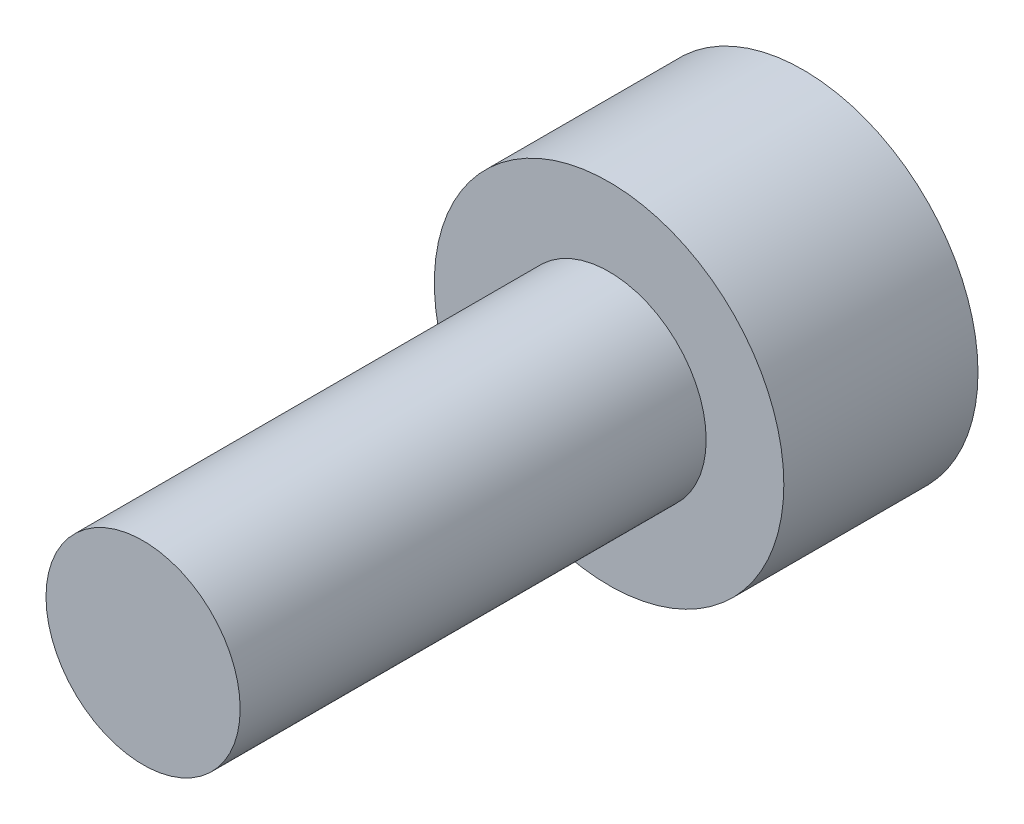
ISO-10303-21;
HEADER;
FILE_DESCRIPTION(('STEP AP214'),'2;1');
FILE_NAME('part.step','',(''),(''),'','','');
FILE_SCHEMA(('AUTOMOTIVE_DESIGN { 1 0 10303 214 1 1 1 1 }'));
ENDSEC;
DATA;
#1=APPLICATION_CONTEXT('core data for automotive mechanical design processes');
#2=APPLICATION_PROTOCOL_DEFINITION('international standard','automotive_design',2000,#1);
#3=PRODUCT_CONTEXT('',#1,'mechanical');
#4=PRODUCT('Part','Part','',(#3));
#5=PRODUCT_RELATED_PRODUCT_CATEGORY('part','',(#4));
#6=PRODUCT_DEFINITION_FORMATION('','',#4);
#7=PRODUCT_DEFINITION_CONTEXT('part definition',#1,'design');
#8=PRODUCT_DEFINITION('design','',#6,#7);
#9=PRODUCT_DEFINITION_SHAPE('','',#8);
#10=(LENGTH_UNIT() NAMED_UNIT(*) SI_UNIT(.MILLI.,.METRE.));
#11=(NAMED_UNIT(*) PLANE_ANGLE_UNIT() SI_UNIT($,.RADIAN.));
#12=(NAMED_UNIT(*) SI_UNIT($,.STERADIAN.) SOLID_ANGLE_UNIT());
#13=UNCERTAINTY_MEASURE_WITH_UNIT(LENGTH_MEASURE(1.E-05),#10,'distance_accuracy_value','');
#14=(GEOMETRIC_REPRESENTATION_CONTEXT(3) GLOBAL_UNCERTAINTY_ASSIGNED_CONTEXT((#13)) GLOBAL_UNIT_ASSIGNED_CONTEXT((#10,
#11,#12)) REPRESENTATION_CONTEXT('',''));
#15=CARTESIAN_POINT('',(0.,0.,0.));
#16=DIRECTION('',(0.,0.,1.));
#17=DIRECTION('',(1.,0.,0.));
#18=AXIS2_PLACEMENT_3D('',#15,#16,#17);
#19=CARTESIAN_POINT('',(0.,0.,-2.5));
#20=DIRECTION('',(0.,0.,1.));
#21=DIRECTION('',(1.,0.,0.));
#22=AXIS2_PLACEMENT_3D('',#19,#20,#21);
#23=PLANE('',#22);
#24=CARTESIAN_POINT('',(0.,0.,-2.5));
#25=DIRECTION('',(0.,0.,1.));
#26=DIRECTION('',(1.,0.,0.));
#27=AXIS2_PLACEMENT_3D('',#24,#25,#26);
#28=CIRCLE('',#27,2.25);
#29=CARTESIAN_POINT('',(2.25,0.,-2.5));
#30=VERTEX_POINT('',#29);
#31=EDGE_CURVE('E43',#30,#30,#28,.T.);
#32=ORIENTED_EDGE('',*,*,#31,.F.);
#33=EDGE_LOOP('',(#32));
#34=FACE_BOUND('',#33,.T.);
#35=DIRECTION('',(0.866025403784441,-0.499999999999995,0.));
#36=VECTOR('',#35,1.);
#37=CARTESIAN_POINT('',(-0.999999999999993,-0.577350269189637,-2.5));
#38=LINE('',#37,#36);
#39=CARTESIAN_POINT('',(-0.999999999999993,-0.577350269189637,-2.5));
#40=VERTEX_POINT('',#39);
#41=CARTESIAN_POINT('',(0.,-1.15470053837925,-2.5));
#42=VERTEX_POINT('',#41);
#43=EDGE_CURVE('E57',#40,#42,#38,.T.);
#44=ORIENTED_EDGE('',*,*,#43,.T.);
#45=DIRECTION('',(0.866025403784438,0.500000000000001,0.));
#46=VECTOR('',#45,1.);
#47=CARTESIAN_POINT('',(0.,-1.15470053837925,-2.5));
#48=LINE('',#47,#46);
#49=CARTESIAN_POINT('',(1.,-0.577350269189624,-2.5));
#50=VERTEX_POINT('',#49);
#51=EDGE_CURVE('E126',#42,#50,#48,.T.);
#52=ORIENTED_EDGE('',*,*,#51,.T.);
#53=DIRECTION('',(0.,1.,0.));
#54=VECTOR('',#53,1.);
#55=CARTESIAN_POINT('',(1.,-0.577350269189624,-2.5));
#56=LINE('',#55,#54);
#57=CARTESIAN_POINT('',(0.999999999999998,0.57735026918963,-2.5));
#58=VERTEX_POINT('',#57);
#59=EDGE_CURVE('E127',#50,#58,#56,.T.);
#60=ORIENTED_EDGE('',*,*,#59,.T.);
#61=DIRECTION('',(-0.866025403784442,0.499999999999995,0.));
#62=VECTOR('',#61,1.);
#63=CARTESIAN_POINT('',(0.999999999999998,0.57735026918963,-2.5));
#64=LINE('',#63,#62);
#65=CARTESIAN_POINT('',(0.,1.15470053837925,-2.5));
#66=VERTEX_POINT('',#65);
#67=EDGE_CURVE('E134',#58,#66,#64,.T.);
#68=ORIENTED_EDGE('',*,*,#67,.T.);
#69=DIRECTION('',(-0.866025403784434,-0.500000000000007,0.));
#70=VECTOR('',#69,1.);
#71=CARTESIAN_POINT('',(0.,1.15470053837925,-2.5));
#72=LINE('',#71,#70);
#73=CARTESIAN_POINT('',(-1.00000000000001,0.577350269189617,-2.5));
#74=VERTEX_POINT('',#73);
#75=EDGE_CURVE('E120',#66,#74,#72,.T.);
#76=ORIENTED_EDGE('',*,*,#75,.T.);
#77=DIRECTION('',(0.,-1.,0.));
#78=VECTOR('',#77,1.);
#79=CARTESIAN_POINT('',(-1.00000000000001,0.577350269189617,-2.5));
#80=LINE('',#79,#78);
#81=EDGE_CURVE('E137',#74,#40,#80,.T.);
#82=ORIENTED_EDGE('',*,*,#81,.T.);
#83=EDGE_LOOP('',(#44,#52,#60,#68,#76,#82));
#84=FACE_BOUND('',#83,.T.);
#85=ADVANCED_FACE('F39',(#34,#84),#23,.F.);
#86=CARTESIAN_POINT('',(0.,0.,0.));
#87=DIRECTION('',(0.,0.,-1.));
#88=DIRECTION('',(-1.,0.,0.));
#89=AXIS2_PLACEMENT_3D('',#86,#87,#88);
#90=CYLINDRICAL_SURFACE('',#89,2.25);
#91=CARTESIAN_POINT('',(0.,0.,0.));
#92=DIRECTION('',(0.,0.,1.));
#93=DIRECTION('',(1.,0.,0.));
#94=AXIS2_PLACEMENT_3D('',#91,#92,#93);
#95=CIRCLE('',#94,2.25);
#96=CARTESIAN_POINT('',(2.25,0.,0.));
#97=VERTEX_POINT('',#96);
#98=EDGE_CURVE('E48',#97,#97,#95,.T.);
#99=ORIENTED_EDGE('',*,*,#98,.F.);
#100=EDGE_LOOP('',(#99));
#101=FACE_BOUND('',#100,.T.);
#102=ORIENTED_EDGE('',*,*,#31,.T.);
#103=EDGE_LOOP('',(#102));
#104=FACE_BOUND('',#103,.T.);
#105=ADVANCED_FACE('F41',(#101,#104),#90,.T.);
#106=CARTESIAN_POINT('',(0.,0.,0.));
#107=DIRECTION('',(0.,0.,1.));
#108=DIRECTION('',(1.,0.,0.));
#109=AXIS2_PLACEMENT_3D('',#106,#107,#108);
#110=PLANE('',#109);
#111=CARTESIAN_POINT('',(0.,0.,0.));
#112=DIRECTION('',(0.,0.,1.));
#113=DIRECTION('',(1.,0.,0.));
#114=AXIS2_PLACEMENT_3D('',#111,#112,#113);
#115=CIRCLE('',#114,1.25);
#116=CARTESIAN_POINT('',(1.25,0.,0.));
#117=VERTEX_POINT('',#116);
#118=EDGE_CURVE('E11',#117,#117,#115,.T.);
#119=ORIENTED_EDGE('',*,*,#118,.F.);
#120=EDGE_LOOP('',(#119));
#121=FACE_BOUND('',#120,.T.);
#122=ORIENTED_EDGE('',*,*,#98,.T.);
#123=EDGE_LOOP('',(#122));
#124=FACE_BOUND('',#123,.T.);
#125=ADVANCED_FACE('F187',(#121,#124),#110,.T.);
#126=CARTESIAN_POINT('',(0.,0.,6.));
#127=DIRECTION('',(0.,0.,-1.));
#128=DIRECTION('',(-1.,0.,0.));
#129=AXIS2_PLACEMENT_3D('',#126,#127,#128);
#130=CYLINDRICAL_SURFACE('',#129,1.25);
#131=CARTESIAN_POINT('',(0.,0.,6.));
#132=DIRECTION('',(0.,0.,1.));
#133=DIRECTION('',(1.,0.,0.));
#134=AXIS2_PLACEMENT_3D('',#131,#132,#133);
#135=CIRCLE('',#134,1.25);
#136=CARTESIAN_POINT('',(1.25,0.,6.));
#137=VERTEX_POINT('',#136);
#138=EDGE_CURVE('E146',#137,#137,#135,.T.);
#139=ORIENTED_EDGE('',*,*,#138,.F.);
#140=EDGE_LOOP('',(#139));
#141=FACE_BOUND('',#140,.T.);
#142=ORIENTED_EDGE('',*,*,#118,.T.);
#143=EDGE_LOOP('',(#142));
#144=FACE_BOUND('',#143,.T.);
#145=ADVANCED_FACE('F185',(#141,#144),#130,.T.);
#146=CARTESIAN_POINT('',(0.,0.,6.));
#147=DIRECTION('',(0.,0.,1.));
#148=DIRECTION('',(1.,0.,0.));
#149=AXIS2_PLACEMENT_3D('',#146,#147,#148);
#150=PLANE('',#149);
#151=ORIENTED_EDGE('',*,*,#138,.T.);
#152=EDGE_LOOP('',(#151));
#153=FACE_BOUND('',#152,.T.);
#154=ADVANCED_FACE('F176',(#153),#150,.T.);
#155=CARTESIAN_POINT('',(-0.999999999999993,-0.577350269189637,-1.25));
#156=DIRECTION('',(0.499999999999995,0.866025403784441,0.));
#157=DIRECTION('',(-0.866025403784441,0.499999999999995,0.));
#158=AXIS2_PLACEMENT_3D('',#155,#156,#157);
#159=PLANE('',#158);
#160=ORIENTED_EDGE('',*,*,#43,.F.);
#161=DIRECTION('',(0.,0.,-1.));
#162=VECTOR('',#161,1.);
#163=CARTESIAN_POINT('',(-0.999999999999993,-0.577350269189637,-1.25));
#164=LINE('',#163,#162);
#165=CARTESIAN_POINT('',(-0.999999999999993,-0.577350269189637,-1.25));
#166=VERTEX_POINT('',#165);
#167=EDGE_CURVE('E125',#166,#40,#164,.T.);
#168=ORIENTED_EDGE('',*,*,#167,.F.);
#169=DIRECTION('',(0.866025403784441,-0.499999999999995,0.));
#170=VECTOR('',#169,1.);
#171=CARTESIAN_POINT('',(-0.999999999999993,-0.577350269189637,-1.25));
#172=LINE('',#171,#170);
#173=CARTESIAN_POINT('',(0.,-1.15470053837925,-1.25));
#174=VERTEX_POINT('',#173);
#175=EDGE_CURVE('E139',#166,#174,#172,.T.);
#176=ORIENTED_EDGE('',*,*,#175,.T.);
#177=DIRECTION('',(0.,0.,-1.));
#178=VECTOR('',#177,1.);
#179=CARTESIAN_POINT('',(0.,-1.15470053837925,-1.25));
#180=LINE('',#179,#178);
#181=EDGE_CURVE('E143',#174,#42,#180,.T.);
#182=ORIENTED_EDGE('',*,*,#181,.T.);
#183=EDGE_LOOP('',(#160,#168,#176,#182));
#184=FACE_BOUND('',#183,.T.);
#185=ADVANCED_FACE('F159',(#184),#159,.T.);
#186=CARTESIAN_POINT('',(0.,-1.15470053837925,-1.25));
#187=DIRECTION('',(-0.500000000000001,0.866025403784438,0.));
#188=DIRECTION('',(-0.866025403784438,-0.500000000000001,0.));
#189=AXIS2_PLACEMENT_3D('',#186,#187,#188);
#190=PLANE('',#189);
#191=ORIENTED_EDGE('',*,*,#51,.F.);
#192=ORIENTED_EDGE('',*,*,#181,.F.);
#193=DIRECTION('',(0.866025403784438,0.500000000000001,0.));
#194=VECTOR('',#193,1.);
#195=CARTESIAN_POINT('',(0.,-1.15470053837925,-1.25));
#196=LINE('',#195,#194);
#197=CARTESIAN_POINT('',(1.,-0.577350269189624,-1.25));
#198=VERTEX_POINT('',#197);
#199=EDGE_CURVE('E91',#174,#198,#196,.T.);
#200=ORIENTED_EDGE('',*,*,#199,.T.);
#201=DIRECTION('',(0.,0.,-1.));
#202=VECTOR('',#201,1.);
#203=CARTESIAN_POINT('',(1.,-0.577350269189624,-1.25));
#204=LINE('',#203,#202);
#205=EDGE_CURVE('E141',#198,#50,#204,.T.);
#206=ORIENTED_EDGE('',*,*,#205,.T.);
#207=EDGE_LOOP('',(#191,#192,#200,#206));
#208=FACE_BOUND('',#207,.T.);
#209=ADVANCED_FACE('F166',(#208),#190,.T.);
#210=CARTESIAN_POINT('',(1.,-0.577350269189624,-1.25));
#211=DIRECTION('',(-1.,0.,0.));
#212=DIRECTION('',(0.,-1.,0.));
#213=AXIS2_PLACEMENT_3D('',#210,#211,#212);
#214=PLANE('',#213);
#215=ORIENTED_EDGE('',*,*,#59,.F.);
#216=ORIENTED_EDGE('',*,*,#205,.F.);
#217=DIRECTION('',(0.,1.,0.));
#218=VECTOR('',#217,1.);
#219=CARTESIAN_POINT('',(1.,-0.577350269189624,-1.25));
#220=LINE('',#219,#218);
#221=CARTESIAN_POINT('',(0.999999999999998,0.57735026918963,-1.25));
#222=VERTEX_POINT('',#221);
#223=EDGE_CURVE('E113',#198,#222,#220,.T.);
#224=ORIENTED_EDGE('',*,*,#223,.T.);
#225=DIRECTION('',(0.,0.,-1.));
#226=VECTOR('',#225,1.);
#227=CARTESIAN_POINT('',(0.999999999999998,0.57735026918963,-1.25));
#228=LINE('',#227,#226);
#229=EDGE_CURVE('E109',#222,#58,#228,.T.);
#230=ORIENTED_EDGE('',*,*,#229,.T.);
#231=EDGE_LOOP('',(#215,#216,#224,#230));
#232=FACE_BOUND('',#231,.T.);
#233=ADVANCED_FACE('F168',(#232),#214,.T.);
#234=CARTESIAN_POINT('',(0.999999999999998,0.57735026918963,-1.25));
#235=DIRECTION('',(-0.499999999999995,-0.866025403784442,0.));
#236=DIRECTION('',(0.866025403784442,-0.499999999999995,0.));
#237=AXIS2_PLACEMENT_3D('',#234,#235,#236);
#238=PLANE('',#237);
#239=ORIENTED_EDGE('',*,*,#67,.F.);
#240=ORIENTED_EDGE('',*,*,#229,.F.);
#241=DIRECTION('',(-0.866025403784442,0.499999999999995,0.));
#242=VECTOR('',#241,1.);
#243=CARTESIAN_POINT('',(0.999999999999998,0.57735026918963,-1.25));
#244=LINE('',#243,#242);
#245=CARTESIAN_POINT('',(0.,1.15470053837925,-1.25));
#246=VERTEX_POINT('',#245);
#247=EDGE_CURVE('E102',#222,#246,#244,.T.);
#248=ORIENTED_EDGE('',*,*,#247,.T.);
#249=DIRECTION('',(0.,0.,-1.));
#250=VECTOR('',#249,1.);
#251=CARTESIAN_POINT('',(0.,1.15470053837925,-1.25));
#252=LINE('',#251,#250);
#253=EDGE_CURVE('E107',#246,#66,#252,.T.);
#254=ORIENTED_EDGE('',*,*,#253,.T.);
#255=EDGE_LOOP('',(#239,#240,#248,#254));
#256=FACE_BOUND('',#255,.T.);
#257=ADVANCED_FACE('F108',(#256),#238,.T.);
#258=CARTESIAN_POINT('',(0.,1.15470053837925,-1.25));
#259=DIRECTION('',(0.500000000000007,-0.866025403784435,0.));
#260=DIRECTION('',(0.866025403784435,0.500000000000007,0.));
#261=AXIS2_PLACEMENT_3D('',#258,#259,#260);
#262=PLANE('',#261);
#263=ORIENTED_EDGE('',*,*,#75,.F.);
#264=ORIENTED_EDGE('',*,*,#253,.F.);
#265=DIRECTION('',(-0.866025403784434,-0.500000000000007,0.));
#266=VECTOR('',#265,1.);
#267=CARTESIAN_POINT('',(0.,1.15470053837925,-1.25));
#268=LINE('',#267,#266);
#269=CARTESIAN_POINT('',(-1.00000000000001,0.577350269189617,-1.25));
#270=VERTEX_POINT('',#269);
#271=EDGE_CURVE('E115',#246,#270,#268,.T.);
#272=ORIENTED_EDGE('',*,*,#271,.T.);
#273=DIRECTION('',(0.,0.,-1.));
#274=VECTOR('',#273,1.);
#275=CARTESIAN_POINT('',(-1.00000000000001,0.577350269189617,-1.25));
#276=LINE('',#275,#274);
#277=EDGE_CURVE('E86',#270,#74,#276,.T.);
#278=ORIENTED_EDGE('',*,*,#277,.T.);
#279=EDGE_LOOP('',(#263,#264,#272,#278));
#280=FACE_BOUND('',#279,.T.);
#281=ADVANCED_FACE('F114',(#280),#262,.T.);
#282=CARTESIAN_POINT('',(-1.00000000000001,0.577350269189617,-1.25));
#283=DIRECTION('',(1.,0.,0.));
#284=DIRECTION('',(0.,1.,0.));
#285=AXIS2_PLACEMENT_3D('',#282,#283,#284);
#286=PLANE('',#285);
#287=ORIENTED_EDGE('',*,*,#81,.F.);
#288=ORIENTED_EDGE('',*,*,#277,.F.);
#289=DIRECTION('',(0.,-1.,0.));
#290=VECTOR('',#289,1.);
#291=CARTESIAN_POINT('',(-1.00000000000001,0.577350269189617,-1.25));
#292=LINE('',#291,#290);
#293=EDGE_CURVE('E63',#270,#166,#292,.T.);
#294=ORIENTED_EDGE('',*,*,#293,.T.);
#295=ORIENTED_EDGE('',*,*,#167,.T.);
#296=EDGE_LOOP('',(#287,#288,#294,#295));
#297=FACE_BOUND('',#296,.T.);
#298=ADVANCED_FACE('F158',(#297),#286,.T.);
#299=CARTESIAN_POINT('',(0.,0.,-1.25));
#300=DIRECTION('',(0.,0.,1.));
#301=DIRECTION('',(1.,0.,0.));
#302=AXIS2_PLACEMENT_3D('',#299,#300,#301);
#303=PLANE('',#302);
#304=ORIENTED_EDGE('',*,*,#175,.F.);
#305=ORIENTED_EDGE('',*,*,#293,.F.);
#306=ORIENTED_EDGE('',*,*,#271,.F.);
#307=ORIENTED_EDGE('',*,*,#247,.F.);
#308=ORIENTED_EDGE('',*,*,#223,.F.);
#309=ORIENTED_EDGE('',*,*,#199,.F.);
#310=EDGE_LOOP('',(#304,#305,#306,#307,#308,#309));
#311=FACE_BOUND('',#310,.T.);
#312=ADVANCED_FACE('F119',(#311),#303,.F.);
#313=CLOSED_SHELL('',(#85,#105,#125,#145,#154,#185,#209,#233,#257,#281,#298,#312));
#314=MANIFOLD_SOLID_BREP('B2',#313);
#315=ADVANCED_BREP_SHAPE_REPRESENTATION('',(#18,#314),#14);
#316=SHAPE_DEFINITION_REPRESENTATION(#9,#315);
ENDSEC;
END-ISO-10303-21;
